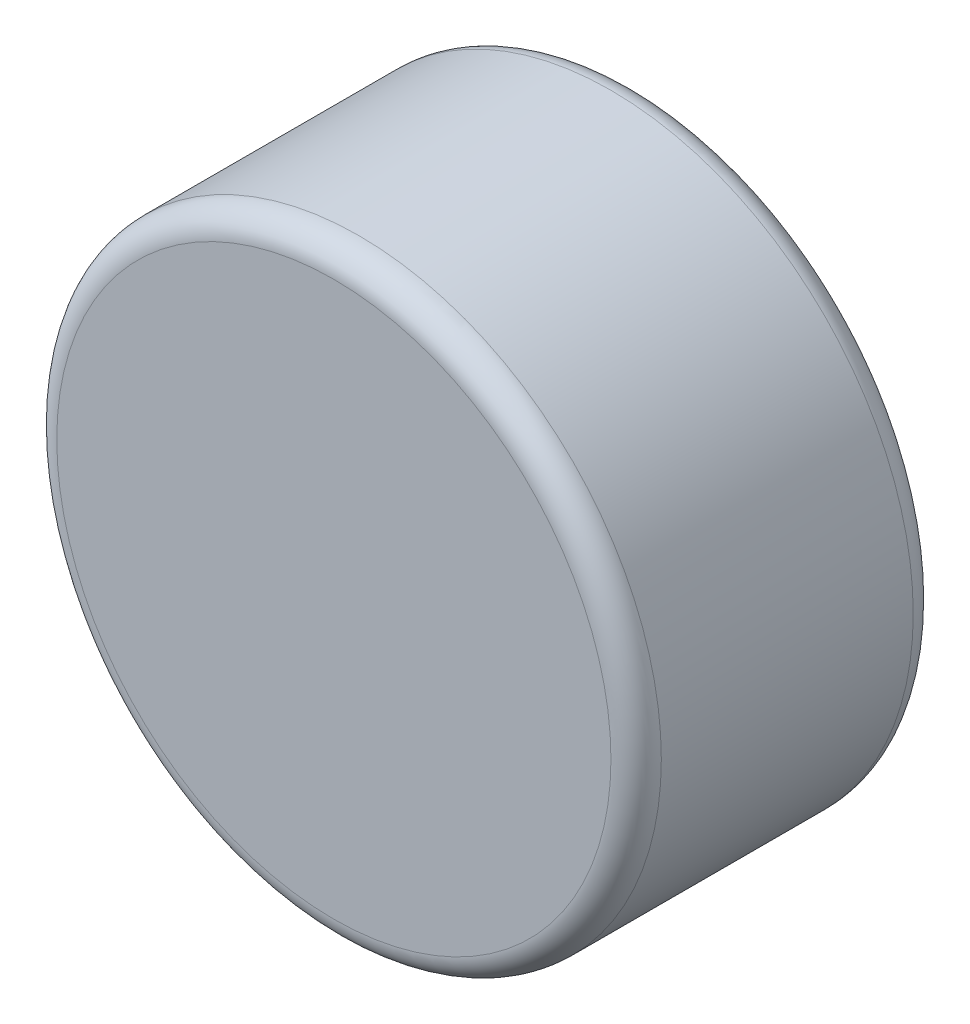
ISO-10303-21;
HEADER;
FILE_DESCRIPTION(('STEP AP214'),'2;1');
FILE_NAME('part.step','',(''),(''),'','','');
FILE_SCHEMA(('AUTOMOTIVE_DESIGN { 1 0 10303 214 1 1 1 1 }'));
ENDSEC;
DATA;
#1=APPLICATION_CONTEXT('core data for automotive mechanical design processes');
#2=APPLICATION_PROTOCOL_DEFINITION('international standard','automotive_design',2000,#1);
#3=PRODUCT_CONTEXT('',#1,'mechanical');
#4=PRODUCT('Part','Part','',(#3));
#5=PRODUCT_RELATED_PRODUCT_CATEGORY('part','',(#4));
#6=PRODUCT_DEFINITION_FORMATION('','',#4);
#7=PRODUCT_DEFINITION_CONTEXT('part definition',#1,'design');
#8=PRODUCT_DEFINITION('design','',#6,#7);
#9=PRODUCT_DEFINITION_SHAPE('','',#8);
#10=(LENGTH_UNIT() NAMED_UNIT(*) SI_UNIT(.MILLI.,.METRE.));
#11=(NAMED_UNIT(*) PLANE_ANGLE_UNIT() SI_UNIT($,.RADIAN.));
#12=(NAMED_UNIT(*) SI_UNIT($,.STERADIAN.) SOLID_ANGLE_UNIT());
#13=UNCERTAINTY_MEASURE_WITH_UNIT(LENGTH_MEASURE(1.E-05),#10,'distance_accuracy_value','');
#14=(GEOMETRIC_REPRESENTATION_CONTEXT(3) GLOBAL_UNCERTAINTY_ASSIGNED_CONTEXT((#13)) GLOBAL_UNIT_ASSIGNED_CONTEXT((#10,
#11,#12)) REPRESENTATION_CONTEXT('',''));
#15=CARTESIAN_POINT('',(0.,0.,0.));
#16=DIRECTION('',(0.,0.,1.));
#17=DIRECTION('',(1.,0.,0.));
#18=AXIS2_PLACEMENT_3D('',#15,#16,#17);
#19=CARTESIAN_POINT('',(0.,0.,3.));
#20=DIRECTION('',(0.,0.,-1.));
#21=DIRECTION('',(-1.,0.,0.));
#22=AXIS2_PLACEMENT_3D('',#19,#20,#21);
#23=CYLINDRICAL_SURFACE('',#22,3.);
#24=CARTESIAN_POINT('',(0.,0.,0.25));
#25=DIRECTION('',(0.,0.,1.));
#26=DIRECTION('',(1.,0.,0.));
#27=AXIS2_PLACEMENT_3D('',#24,#25,#26);
#28=CIRCLE('',#27,3.);
#29=CARTESIAN_POINT('',(3.,0.,0.25));
#30=VERTEX_POINT('',#29);
#31=EDGE_CURVE('E50',#30,#30,#28,.T.);
#32=ORIENTED_EDGE('',*,*,#31,.T.);
#33=EDGE_LOOP('',(#32));
#34=FACE_BOUND('',#33,.T.);
#35=CARTESIAN_POINT('',(0.,0.,2.75));
#36=DIRECTION('',(0.,0.,1.));
#37=DIRECTION('',(1.,0.,0.));
#38=AXIS2_PLACEMENT_3D('',#35,#36,#37);
#39=CIRCLE('',#38,3.);
#40=CARTESIAN_POINT('',(3.,0.,2.75));
#41=VERTEX_POINT('',#40);
#42=EDGE_CURVE('E55',#41,#41,#39,.F.);
#43=ORIENTED_EDGE('',*,*,#42,.T.);
#44=EDGE_LOOP('',(#43));
#45=FACE_BOUND('',#44,.T.);
#46=ADVANCED_FACE('F37',(#34,#45),#23,.T.);
#47=CARTESIAN_POINT('',(0.,0.,3.));
#48=DIRECTION('',(0.,0.,1.));
#49=DIRECTION('',(1.,0.,0.));
#50=AXIS2_PLACEMENT_3D('',#47,#48,#49);
#51=PLANE('',#50);
#52=CARTESIAN_POINT('',(0.,0.,3.));
#53=DIRECTION('',(0.,0.,1.));
#54=DIRECTION('',(1.,0.,0.));
#55=AXIS2_PLACEMENT_3D('',#52,#53,#54);
#56=CIRCLE('',#55,2.75);
#57=CARTESIAN_POINT('',(2.75,0.,3.));
#58=VERTEX_POINT('',#57);
#59=EDGE_CURVE('E10',#58,#58,#56,.T.);
#60=ORIENTED_EDGE('',*,*,#59,.T.);
#61=EDGE_LOOP('',(#60));
#62=FACE_BOUND('',#61,.T.);
#63=ADVANCED_FACE('F72',(#62),#51,.T.);
#64=CARTESIAN_POINT('',(0.,0.,0.));
#65=DIRECTION('',(0.,0.,1.));
#66=DIRECTION('',(1.,0.,0.));
#67=AXIS2_PLACEMENT_3D('',#64,#65,#66);
#68=PLANE('',#67);
#69=CARTESIAN_POINT('',(0.,0.,0.));
#70=DIRECTION('',(0.,0.,1.));
#71=DIRECTION('',(1.,0.,0.));
#72=AXIS2_PLACEMENT_3D('',#69,#70,#71);
#73=CIRCLE('',#72,2.75);
#74=CARTESIAN_POINT('',(2.75,0.,0.));
#75=VERTEX_POINT('',#74);
#76=EDGE_CURVE('E45',#75,#75,#73,.F.);
#77=ORIENTED_EDGE('',*,*,#76,.T.);
#78=EDGE_LOOP('',(#77));
#79=FACE_BOUND('',#78,.T.);
#80=ADVANCED_FACE('F69',(#79),#68,.F.);
#81=CARTESIAN_POINT('',(0.,0.,0.25));
#82=DIRECTION('',(0.,0.,1.));
#83=DIRECTION('',(1.,0.,0.));
#84=AXIS2_PLACEMENT_3D('',#81,#82,#83);
#85=TOROIDAL_SURFACE('',#84,2.75,0.25);
#86=ORIENTED_EDGE('',*,*,#76,.F.);
#87=EDGE_LOOP('',(#86));
#88=FACE_BOUND('',#87,.T.);
#89=ORIENTED_EDGE('',*,*,#31,.F.);
#90=EDGE_LOOP('',(#89));
#91=FACE_BOUND('',#90,.T.);
#92=ADVANCED_FACE('F65',(#88,#91),#85,.T.);
#93=CARTESIAN_POINT('',(0.,0.,2.75));
#94=DIRECTION('',(0.,0.,1.));
#95=DIRECTION('',(1.,0.,0.));
#96=AXIS2_PLACEMENT_3D('',#93,#94,#95);
#97=TOROIDAL_SURFACE('',#96,2.75,0.25);
#98=ORIENTED_EDGE('',*,*,#42,.F.);
#99=EDGE_LOOP('',(#98));
#100=FACE_BOUND('',#99,.T.);
#101=ORIENTED_EDGE('',*,*,#59,.F.);
#102=EDGE_LOOP('',(#101));
#103=FACE_BOUND('',#102,.T.);
#104=ADVANCED_FACE('F39',(#100,#103),#97,.T.);
#105=CLOSED_SHELL('',(#46,#63,#80,#92,#104));
#106=MANIFOLD_SOLID_BREP('B2',#105);
#107=ADVANCED_BREP_SHAPE_REPRESENTATION('',(#18,#106),#14);
#108=SHAPE_DEFINITION_REPRESENTATION(#9,#107);
ENDSEC;
END-ISO-10303-21;
